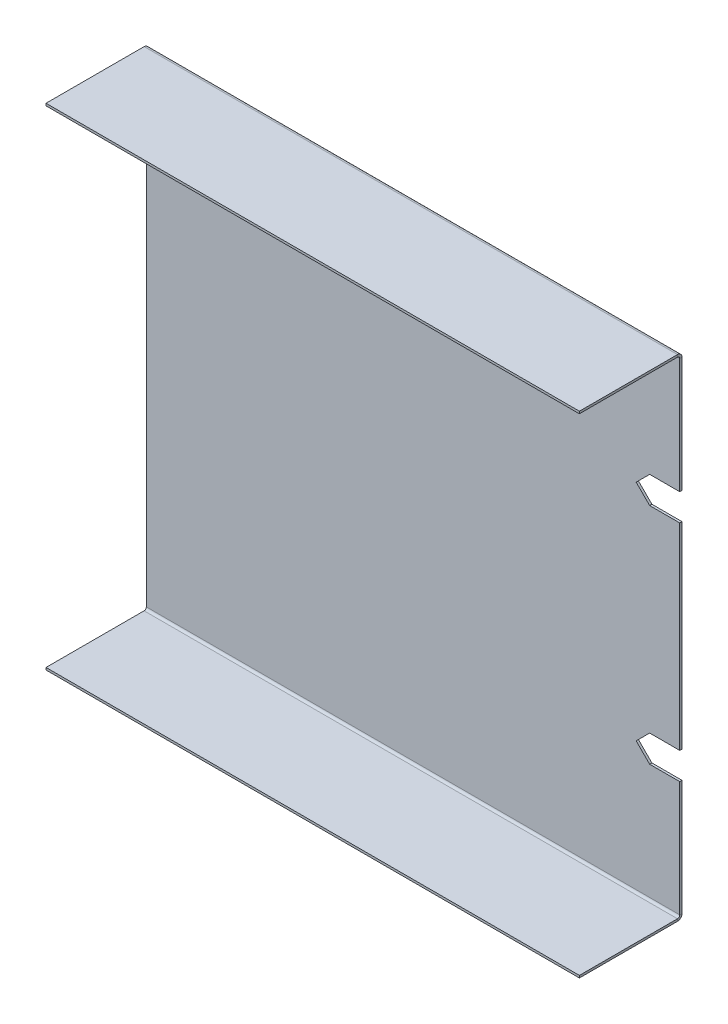
ISO-10303-21;
HEADER;
FILE_DESCRIPTION(('STEP AP214'),'2;1');
FILE_NAME('part.step','',(''),(''),'','','');
FILE_SCHEMA(('AUTOMOTIVE_DESIGN { 1 0 10303 214 1 1 1 1 }'));
ENDSEC;
DATA;
#1=APPLICATION_CONTEXT('core data for automotive mechanical design processes');
#2=APPLICATION_PROTOCOL_DEFINITION('international standard','automotive_design',2000,#1);
#3=PRODUCT_CONTEXT('',#1,'mechanical');
#4=PRODUCT('Part','Part','',(#3));
#5=PRODUCT_RELATED_PRODUCT_CATEGORY('part','',(#4));
#6=PRODUCT_DEFINITION_FORMATION('','',#4);
#7=PRODUCT_DEFINITION_CONTEXT('part definition',#1,'design');
#8=PRODUCT_DEFINITION('design','',#6,#7);
#9=PRODUCT_DEFINITION_SHAPE('','',#8);
#10=(LENGTH_UNIT() NAMED_UNIT(*) SI_UNIT(.MILLI.,.METRE.));
#11=(NAMED_UNIT(*) PLANE_ANGLE_UNIT() SI_UNIT($,.RADIAN.));
#12=(NAMED_UNIT(*) SI_UNIT($,.STERADIAN.) SOLID_ANGLE_UNIT());
#13=UNCERTAINTY_MEASURE_WITH_UNIT(LENGTH_MEASURE(1.E-05),#10,'distance_accuracy_value','');
#14=(GEOMETRIC_REPRESENTATION_CONTEXT(3) GLOBAL_UNCERTAINTY_ASSIGNED_CONTEXT((#13)) GLOBAL_UNIT_ASSIGNED_CONTEXT((#10,
#11,#12)) REPRESENTATION_CONTEXT('',''));
#15=CARTESIAN_POINT('',(0.,0.,0.));
#16=DIRECTION('',(0.,0.,1.));
#17=DIRECTION('',(1.,0.,0.));
#18=AXIS2_PLACEMENT_3D('',#15,#16,#17);
#19=CARTESIAN_POINT('',(0.,0.,-1.5));
#20=DIRECTION('',(0.,0.,1.));
#21=DIRECTION('',(1.,0.,0.));
#22=AXIS2_PLACEMENT_3D('',#19,#20,#21);
#23=PLANE('',#22);
#24=DIRECTION('',(0.,1.,0.));
#25=VECTOR('',#24,1.);
#26=CARTESIAN_POINT('',(192.25,-83.48,-1.5));
#27=LINE('',#26,#25);
#28=CARTESIAN_POINT('',(192.25,-160.232854132356,-1.5));
#29=VERTEX_POINT('',#28);
#30=CARTESIAN_POINT('',(192.25,-83.48,-1.5));
#31=VERTEX_POINT('',#30);
#32=EDGE_CURVE('E50',#29,#31,#27,.T.);
#33=ORIENTED_EDGE('',*,*,#32,.F.);
#34=DIRECTION('',(-1.,0.,0.));
#35=VECTOR('',#34,1.);
#36=CARTESIAN_POINT('',(0.,-160.232854132356,-1.5));
#37=LINE('',#36,#35);
#38=CARTESIAN_POINT('',(-162.5,-160.232854132356,-1.5));
#39=VERTEX_POINT('',#38);
#40=EDGE_CURVE('E368',#29,#39,#37,.T.);
#41=ORIENTED_EDGE('',*,*,#40,.T.);
#42=DIRECTION('',(0.,-1.,0.));
#43=VECTOR('',#42,1.);
#44=CARTESIAN_POINT('',(-162.5,-229.,-1.5));
#45=LINE('',#44,#43);
#46=CARTESIAN_POINT('',(-162.5,160.232854132356,-1.5));
#47=VERTEX_POINT('',#46);
#48=EDGE_CURVE('E255',#47,#39,#45,.T.);
#49=ORIENTED_EDGE('',*,*,#48,.F.);
#50=DIRECTION('',(-1.,0.,0.));
#51=VECTOR('',#50,1.);
#52=CARTESIAN_POINT('',(0.,160.232854132356,-1.5));
#53=LINE('',#52,#51);
#54=CARTESIAN_POINT('',(192.25,160.232854132356,-1.5));
#55=VERTEX_POINT('',#54);
#56=EDGE_CURVE('E248',#55,#47,#53,.T.);
#57=ORIENTED_EDGE('',*,*,#56,.F.);
#58=DIRECTION('',(0.,1.,0.));
#59=VECTOR('',#58,1.);
#60=CARTESIAN_POINT('',(192.25,83.48,-1.5));
#61=LINE('',#60,#59);
#62=CARTESIAN_POINT('',(192.25,83.48,-1.5));
#63=VERTEX_POINT('',#62);
#64=EDGE_CURVE('E291',#63,#55,#61,.T.);
#65=ORIENTED_EDGE('',*,*,#64,.F.);
#66=DIRECTION('',(1.,0.,0.));
#67=VECTOR('',#66,1.);
#68=CARTESIAN_POINT('',(172.25,83.48,-1.5));
#69=LINE('',#68,#67);
#70=CARTESIAN_POINT('',(172.25,83.48,-1.5));
#71=VERTEX_POINT('',#70);
#72=EDGE_CURVE('E296',#71,#63,#69,.T.);
#73=ORIENTED_EDGE('',*,*,#72,.F.);
#74=DIRECTION('',(0.707106781186549,0.707106781186546,0.));
#75=VECTOR('',#74,1.);
#76=CARTESIAN_POINT('',(172.25,83.48,-1.5));
#77=LINE('',#76,#75);
#78=CARTESIAN_POINT('',(163.27,74.5,-1.5));
#79=VERTEX_POINT('',#78);
#80=EDGE_CURVE('E301',#79,#71,#77,.T.);
#81=ORIENTED_EDGE('',*,*,#80,.F.);
#82=DIRECTION('',(-0.707106781186549,0.707106781186546,0.));
#83=VECTOR('',#82,1.);
#84=CARTESIAN_POINT('',(163.27,74.5,-1.5));
#85=LINE('',#84,#83);
#86=CARTESIAN_POINT('',(172.25,65.52,-1.5));
#87=VERTEX_POINT('',#86);
#88=EDGE_CURVE('E306',#87,#79,#85,.T.);
#89=ORIENTED_EDGE('',*,*,#88,.F.);
#90=DIRECTION('',(-1.,0.,0.));
#91=VECTOR('',#90,1.);
#92=CARTESIAN_POINT('',(172.25,65.52,-1.5));
#93=LINE('',#92,#91);
#94=CARTESIAN_POINT('',(192.25,65.52,-1.5));
#95=VERTEX_POINT('',#94);
#96=EDGE_CURVE('E311',#95,#87,#93,.T.);
#97=ORIENTED_EDGE('',*,*,#96,.F.);
#98=DIRECTION('',(0.,1.,0.));
#99=VECTOR('',#98,1.);
#100=CARTESIAN_POINT('',(192.25,65.52,-1.5));
#101=LINE('',#100,#99);
#102=CARTESIAN_POINT('',(192.25,-65.5199999999999,-1.5));
#103=VERTEX_POINT('',#102);
#104=EDGE_CURVE('E316',#103,#95,#101,.T.);
#105=ORIENTED_EDGE('',*,*,#104,.F.);
#106=DIRECTION('',(1.,0.,0.));
#107=VECTOR('',#106,1.);
#108=CARTESIAN_POINT('',(172.25,-65.52,-1.5));
#109=LINE('',#108,#107);
#110=CARTESIAN_POINT('',(172.25,-65.52,-1.5));
#111=VERTEX_POINT('',#110);
#112=EDGE_CURVE('E321',#111,#103,#109,.T.);
#113=ORIENTED_EDGE('',*,*,#112,.F.);
#114=DIRECTION('',(0.707106781186549,0.707106781186546,0.));
#115=VECTOR('',#114,1.);
#116=CARTESIAN_POINT('',(163.27,-74.5,-1.5));
#117=LINE('',#116,#115);
#118=CARTESIAN_POINT('',(163.27,-74.5,-1.5));
#119=VERTEX_POINT('',#118);
#120=EDGE_CURVE('E326',#119,#111,#117,.T.);
#121=ORIENTED_EDGE('',*,*,#120,.F.);
#122=DIRECTION('',(-0.707106781186549,0.707106781186546,0.));
#123=VECTOR('',#122,1.);
#124=CARTESIAN_POINT('',(172.25,-83.48,-1.5));
#125=LINE('',#124,#123);
#126=CARTESIAN_POINT('',(172.25,-83.48,-1.5));
#127=VERTEX_POINT('',#126);
#128=EDGE_CURVE('E331',#127,#119,#125,.T.);
#129=ORIENTED_EDGE('',*,*,#128,.F.);
#130=DIRECTION('',(-1.,0.,0.));
#131=VECTOR('',#130,1.);
#132=CARTESIAN_POINT('',(172.25,-83.48,-1.5));
#133=LINE('',#132,#131);
#134=EDGE_CURVE('E336',#31,#127,#133,.T.);
#135=ORIENTED_EDGE('',*,*,#134,.F.);
#136=EDGE_LOOP('',(#33,#41,#49,#57,#65,#73,#81,#89,#97,#105,#113,#121,#129,#135));
#137=FACE_BOUND('',#136,.T.);
#138=ADVANCED_FACE('F46',(#137),#23,.F.);
#139=CARTESIAN_POINT('',(0.,163.232854132356,-162.267145867644));
#140=DIRECTION('',(0.,-1.,0.));
#141=DIRECTION('',(1.,0.,0.));
#142=AXIS2_PLACEMENT_3D('',#139,#140,#141);
#143=PLANE('',#142);
#144=DIRECTION('',(0.,0.,1.));
#145=VECTOR('',#144,1.);
#146=CARTESIAN_POINT('',(192.25,163.232854132356,-78.7871458676443));
#147=LINE('',#146,#145);
#148=CARTESIAN_POINT('',(192.25,163.232854132356,1.5));
#149=VERTEX_POINT('',#148);
#150=CARTESIAN_POINT('',(192.25,163.232854132356,66.7328541323557));
#151=VERTEX_POINT('',#150);
#152=EDGE_CURVE('E356',#149,#151,#147,.T.);
#153=ORIENTED_EDGE('',*,*,#152,.F.);
#154=DIRECTION('',(-1.,0.,0.));
#155=VECTOR('',#154,1.);
#156=CARTESIAN_POINT('',(0.,163.232854132356,1.5));
#157=LINE('',#156,#155);
#158=CARTESIAN_POINT('',(-162.5,163.232854132356,1.49999999999985));
#159=VERTEX_POINT('',#158);
#160=EDGE_CURVE('E353',#149,#159,#157,.T.);
#161=ORIENTED_EDGE('',*,*,#160,.T.);
#162=DIRECTION('',(0.,0.,-1.));
#163=VECTOR('',#162,1.);
#164=CARTESIAN_POINT('',(-162.5,163.232854132357,-391.267145867644));
#165=LINE('',#164,#163);
#166=CARTESIAN_POINT('',(-162.5,163.232854132356,66.7328541323556));
#167=VERTEX_POINT('',#166);
#168=EDGE_CURVE('E344',#167,#159,#165,.T.);
#169=ORIENTED_EDGE('',*,*,#168,.F.);
#170=DIRECTION('',(-1.,0.,0.));
#171=VECTOR('',#170,1.);
#172=CARTESIAN_POINT('',(162.5,163.232854132356,66.7328541323556));
#173=LINE('',#172,#171);
#174=EDGE_CURVE('E342',#151,#167,#173,.T.);
#175=ORIENTED_EDGE('',*,*,#174,.F.);
#176=EDGE_LOOP('',(#153,#161,#169,#175));
#177=FACE_BOUND('',#176,.T.);
#178=ADVANCED_FACE('F458',(#177),#143,.F.);
#179=CARTESIAN_POINT('',(192.25,163.232854132356,-78.7871458676443));
#180=DIRECTION('',(1.,0.,0.));
#181=DIRECTION('',(0.,1.,0.));
#182=AXIS2_PLACEMENT_3D('',#179,#180,#181);
#183=PLANE('',#182);
#184=DIRECTION('',(0.,-1.,0.));
#185=VECTOR('',#184,1.);
#186=CARTESIAN_POINT('',(192.25,163.232854132355,1.50000000000003));
#187=LINE('',#186,#185);
#188=CARTESIAN_POINT('',(192.25,161.732854132356,1.5));
#189=VERTEX_POINT('',#188);
#190=EDGE_CURVE('E359',#149,#189,#187,.T.);
#191=ORIENTED_EDGE('',*,*,#190,.F.);
#192=ORIENTED_EDGE('',*,*,#152,.T.);
#193=DIRECTION('',(0.,-1.,0.));
#194=VECTOR('',#193,1.);
#195=CARTESIAN_POINT('',(192.25,163.232854132356,66.7328541323557));
#196=LINE('',#195,#194);
#197=CARTESIAN_POINT('',(192.25,161.732854132356,66.7328541323557));
#198=VERTEX_POINT('',#197);
#199=EDGE_CURVE('E350',#151,#198,#196,.T.);
#200=ORIENTED_EDGE('',*,*,#199,.T.);
#201=DIRECTION('',(0.,0.,1.));
#202=VECTOR('',#201,1.);
#203=CARTESIAN_POINT('',(192.25,161.732854132356,-78.7871458676443));
#204=LINE('',#203,#202);
#205=EDGE_CURVE('E345',#189,#198,#204,.T.);
#206=ORIENTED_EDGE('',*,*,#205,.F.);
#207=EDGE_LOOP('',(#191,#192,#200,#206));
#208=FACE_BOUND('',#207,.T.);
#209=ADVANCED_FACE('F450',(#208),#183,.T.);
#210=CARTESIAN_POINT('',(-162.5,163.232854132357,-391.267145867644));
#211=DIRECTION('',(-1.,0.,0.));
#212=DIRECTION('',(0.,-1.,0.));
#213=AXIS2_PLACEMENT_3D('',#210,#211,#212);
#214=PLANE('',#213);
#215=DIRECTION('',(0.,1.,0.));
#216=VECTOR('',#215,1.);
#217=CARTESIAN_POINT('',(-162.5,163.232854132353,1.5));
#218=LINE('',#217,#216);
#219=CARTESIAN_POINT('',(-162.5,161.732854132356,1.49999999999989));
#220=VERTEX_POINT('',#219);
#221=EDGE_CURVE('E365',#220,#159,#218,.T.);
#222=ORIENTED_EDGE('',*,*,#221,.F.);
#223=DIRECTION('',(0.,0.,-1.));
#224=VECTOR('',#223,1.);
#225=CARTESIAN_POINT('',(-162.5,161.732854132357,-391.267145867644));
#226=LINE('',#225,#224);
#227=CARTESIAN_POINT('',(-162.5,161.732854132356,66.7328541323556));
#228=VERTEX_POINT('',#227);
#229=EDGE_CURVE('E349',#228,#220,#226,.T.);
#230=ORIENTED_EDGE('',*,*,#229,.F.);
#231=DIRECTION('',(0.,-1.,0.));
#232=VECTOR('',#231,1.);
#233=CARTESIAN_POINT('',(-162.5,163.232854132356,66.7328541323556));
#234=LINE('',#233,#232);
#235=EDGE_CURVE('E354',#167,#228,#234,.T.);
#236=ORIENTED_EDGE('',*,*,#235,.F.);
#237=ORIENTED_EDGE('',*,*,#168,.T.);
#238=EDGE_LOOP('',(#222,#230,#236,#237));
#239=FACE_BOUND('',#238,.T.);
#240=ADVANCED_FACE('F460',(#239),#214,.T.);
#241=CARTESIAN_POINT('',(-162.5,163.232854132356,66.7328541323556));
#242=DIRECTION('',(0.,0.,1.));
#243=DIRECTION('',(0.,-1.,0.));
#244=AXIS2_PLACEMENT_3D('',#241,#242,#243);
#245=PLANE('',#244);
#246=DIRECTION('',(-1.,0.,0.));
#247=VECTOR('',#246,1.);
#248=CARTESIAN_POINT('',(-162.5,161.732854132356,66.7328541323556));
#249=LINE('',#248,#247);
#250=EDGE_CURVE('E346',#198,#228,#249,.T.);
#251=ORIENTED_EDGE('',*,*,#250,.F.);
#252=ORIENTED_EDGE('',*,*,#199,.F.);
#253=ORIENTED_EDGE('',*,*,#174,.T.);
#254=ORIENTED_EDGE('',*,*,#235,.T.);
#255=EDGE_LOOP('',(#251,#252,#253,#254));
#256=FACE_BOUND('',#255,.T.);
#257=ADVANCED_FACE('F454',(#256),#245,.T.);
#258=CARTESIAN_POINT('',(0.,161.732854132356,-162.267145867644));
#259=DIRECTION('',(0.,-1.,0.));
#260=DIRECTION('',(1.,0.,0.));
#261=AXIS2_PLACEMENT_3D('',#258,#259,#260);
#262=PLANE('',#261);
#263=DIRECTION('',(-1.,0.,0.));
#264=VECTOR('',#263,1.);
#265=CARTESIAN_POINT('',(0.,161.732854132356,1.5));
#266=LINE('',#265,#264);
#267=EDGE_CURVE('E362',#189,#220,#266,.T.);
#268=ORIENTED_EDGE('',*,*,#267,.F.);
#269=ORIENTED_EDGE('',*,*,#205,.T.);
#270=ORIENTED_EDGE('',*,*,#250,.T.);
#271=ORIENTED_EDGE('',*,*,#229,.T.);
#272=EDGE_LOOP('',(#268,#269,#270,#271));
#273=FACE_BOUND('',#272,.T.);
#274=ADVANCED_FACE('F444',(#273),#262,.T.);
#275=CARTESIAN_POINT('',(192.25,-83.48,-1.5));
#276=DIRECTION('',(1.,0.,0.));
#277=DIRECTION('',(0.,0.,-1.));
#278=AXIS2_PLACEMENT_3D('',#275,#276,#277);
#279=PLANE('',#278);
#280=DIRECTION('',(0.,0.,1.));
#281=VECTOR('',#280,1.);
#282=CARTESIAN_POINT('',(192.25,-160.232854132356,-1.50000000000054));
#283=LINE('',#282,#281);
#284=CARTESIAN_POINT('',(192.25,-160.232854132356,0.));
#285=VERTEX_POINT('',#284);
#286=EDGE_CURVE('E375',#29,#285,#283,.T.);
#287=ORIENTED_EDGE('',*,*,#286,.F.);
#288=ORIENTED_EDGE('',*,*,#32,.T.);
#289=DIRECTION('',(0.,0.,1.));
#290=VECTOR('',#289,1.);
#291=CARTESIAN_POINT('',(192.25,-83.48,-1.5));
#292=LINE('',#291,#290);
#293=CARTESIAN_POINT('',(192.25,-83.48,0.));
#294=VERTEX_POINT('',#293);
#295=EDGE_CURVE('E339',#31,#294,#292,.T.);
#296=ORIENTED_EDGE('',*,*,#295,.T.);
#297=DIRECTION('',(0.,1.,0.));
#298=VECTOR('',#297,1.);
#299=CARTESIAN_POINT('',(192.25,-83.48,0.));
#300=LINE('',#299,#298);
#301=EDGE_CURVE('E71',#285,#294,#300,.T.);
#302=ORIENTED_EDGE('',*,*,#301,.F.);
#303=EDGE_LOOP('',(#287,#288,#296,#302));
#304=FACE_BOUND('',#303,.T.);
#305=ADVANCED_FACE('F384',(#304),#279,.T.);
#306=CARTESIAN_POINT('',(172.25,-83.48,-1.5));
#307=DIRECTION('',(0.,1.,0.));
#308=DIRECTION('',(0.,0.,1.));
#309=AXIS2_PLACEMENT_3D('',#306,#307,#308);
#310=PLANE('',#309);
#311=DIRECTION('',(-1.,0.,0.));
#312=VECTOR('',#311,1.);
#313=CARTESIAN_POINT('',(172.25,-83.48,0.));
#314=LINE('',#313,#312);
#315=CARTESIAN_POINT('',(172.25,-83.48,0.));
#316=VERTEX_POINT('',#315);
#317=EDGE_CURVE('E280',#294,#316,#314,.T.);
#318=ORIENTED_EDGE('',*,*,#317,.F.);
#319=ORIENTED_EDGE('',*,*,#295,.F.);
#320=ORIENTED_EDGE('',*,*,#134,.T.);
#321=DIRECTION('',(0.,0.,1.));
#322=VECTOR('',#321,1.);
#323=CARTESIAN_POINT('',(172.25,-83.48,-1.5));
#324=LINE('',#323,#322);
#325=EDGE_CURVE('E334',#127,#316,#324,.T.);
#326=ORIENTED_EDGE('',*,*,#325,.T.);
#327=EDGE_LOOP('',(#318,#319,#320,#326));
#328=FACE_BOUND('',#327,.T.);
#329=ADVANCED_FACE('F387',(#328),#310,.T.);
#330=CARTESIAN_POINT('',(172.25,-83.48,-1.5));
#331=DIRECTION('',(0.707106781186546,0.707106781186549,0.));
#332=DIRECTION('',(-0.707106781186549,0.707106781186546,0.));
#333=AXIS2_PLACEMENT_3D('',#330,#331,#332);
#334=PLANE('',#333);
#335=DIRECTION('',(-0.707106781186549,0.707106781186546,0.));
#336=VECTOR('',#335,1.);
#337=CARTESIAN_POINT('',(172.25,-83.48,0.));
#338=LINE('',#337,#336);
#339=CARTESIAN_POINT('',(163.27,-74.5,0.));
#340=VERTEX_POINT('',#339);
#341=EDGE_CURVE('E277',#316,#340,#338,.T.);
#342=ORIENTED_EDGE('',*,*,#341,.F.);
#343=ORIENTED_EDGE('',*,*,#325,.F.);
#344=ORIENTED_EDGE('',*,*,#128,.T.);
#345=DIRECTION('',(0.,0.,1.));
#346=VECTOR('',#345,1.);
#347=CARTESIAN_POINT('',(163.27,-74.5,-1.5));
#348=LINE('',#347,#346);
#349=EDGE_CURVE('E329',#119,#340,#348,.T.);
#350=ORIENTED_EDGE('',*,*,#349,.T.);
#351=EDGE_LOOP('',(#342,#343,#344,#350));
#352=FACE_BOUND('',#351,.T.);
#353=ADVANCED_FACE('F391',(#352),#334,.T.);
#354=CARTESIAN_POINT('',(163.27,-74.5,-1.5));
#355=DIRECTION('',(0.707106781186546,-0.707106781186549,0.));
#356=DIRECTION('',(0.707106781186549,0.707106781186546,0.));
#357=AXIS2_PLACEMENT_3D('',#354,#355,#356);
#358=PLANE('',#357);
#359=DIRECTION('',(0.707106781186549,0.707106781186546,0.));
#360=VECTOR('',#359,1.);
#361=CARTESIAN_POINT('',(163.27,-74.5,0.));
#362=LINE('',#361,#360);
#363=CARTESIAN_POINT('',(172.25,-65.52,0.));
#364=VERTEX_POINT('',#363);
#365=EDGE_CURVE('E274',#340,#364,#362,.T.);
#366=ORIENTED_EDGE('',*,*,#365,.F.);
#367=ORIENTED_EDGE('',*,*,#349,.F.);
#368=ORIENTED_EDGE('',*,*,#120,.T.);
#369=DIRECTION('',(0.,0.,1.));
#370=VECTOR('',#369,1.);
#371=CARTESIAN_POINT('',(172.25,-65.52,-1.5));
#372=LINE('',#371,#370);
#373=EDGE_CURVE('E324',#111,#364,#372,.T.);
#374=ORIENTED_EDGE('',*,*,#373,.T.);
#375=EDGE_LOOP('',(#366,#367,#368,#374));
#376=FACE_BOUND('',#375,.T.);
#377=ADVANCED_FACE('F395',(#376),#358,.T.);
#378=CARTESIAN_POINT('',(172.25,-65.52,-1.5));
#379=DIRECTION('',(0.,-1.,0.));
#380=DIRECTION('',(1.,0.,0.));
#381=AXIS2_PLACEMENT_3D('',#378,#379,#380);
#382=PLANE('',#381);
#383=DIRECTION('',(1.,0.,0.));
#384=VECTOR('',#383,1.);
#385=CARTESIAN_POINT('',(172.25,-65.52,0.));
#386=LINE('',#385,#384);
#387=CARTESIAN_POINT('',(192.25,-65.5199999999999,0.));
#388=VERTEX_POINT('',#387);
#389=EDGE_CURVE('E271',#364,#388,#386,.T.);
#390=ORIENTED_EDGE('',*,*,#389,.F.);
#391=ORIENTED_EDGE('',*,*,#373,.F.);
#392=ORIENTED_EDGE('',*,*,#112,.T.);
#393=DIRECTION('',(0.,0.,1.));
#394=VECTOR('',#393,1.);
#395=CARTESIAN_POINT('',(192.25,-65.5199999999999,-1.5));
#396=LINE('',#395,#394);
#397=EDGE_CURVE('E319',#103,#388,#396,.T.);
#398=ORIENTED_EDGE('',*,*,#397,.T.);
#399=EDGE_LOOP('',(#390,#391,#392,#398));
#400=FACE_BOUND('',#399,.T.);
#401=ADVANCED_FACE('F399',(#400),#382,.T.);
#402=CARTESIAN_POINT('',(192.25,65.52,-1.5));
#403=DIRECTION('',(1.,0.,0.));
#404=DIRECTION('',(0.,1.,0.));
#405=AXIS2_PLACEMENT_3D('',#402,#403,#404);
#406=PLANE('',#405);
#407=DIRECTION('',(0.,1.,0.));
#408=VECTOR('',#407,1.);
#409=CARTESIAN_POINT('',(192.25,65.52,0.));
#410=LINE('',#409,#408);
#411=CARTESIAN_POINT('',(192.25,65.52,0.));
#412=VERTEX_POINT('',#411);
#413=EDGE_CURVE('E268',#388,#412,#410,.T.);
#414=ORIENTED_EDGE('',*,*,#413,.F.);
#415=ORIENTED_EDGE('',*,*,#397,.F.);
#416=ORIENTED_EDGE('',*,*,#104,.T.);
#417=DIRECTION('',(0.,0.,1.));
#418=VECTOR('',#417,1.);
#419=CARTESIAN_POINT('',(192.25,65.52,-1.5));
#420=LINE('',#419,#418);
#421=EDGE_CURVE('E314',#95,#412,#420,.T.);
#422=ORIENTED_EDGE('',*,*,#421,.T.);
#423=EDGE_LOOP('',(#414,#415,#416,#422));
#424=FACE_BOUND('',#423,.T.);
#425=ADVANCED_FACE('F403',(#424),#406,.T.);
#426=CARTESIAN_POINT('',(172.25,65.52,-1.5));
#427=DIRECTION('',(0.,1.,0.));
#428=DIRECTION('',(0.,0.,1.));
#429=AXIS2_PLACEMENT_3D('',#426,#427,#428);
#430=PLANE('',#429);
#431=DIRECTION('',(-1.,0.,0.));
#432=VECTOR('',#431,1.);
#433=CARTESIAN_POINT('',(172.25,65.52,0.));
#434=LINE('',#433,#432);
#435=CARTESIAN_POINT('',(172.25,65.52,0.));
#436=VERTEX_POINT('',#435);
#437=EDGE_CURVE('E265',#412,#436,#434,.T.);
#438=ORIENTED_EDGE('',*,*,#437,.F.);
#439=ORIENTED_EDGE('',*,*,#421,.F.);
#440=ORIENTED_EDGE('',*,*,#96,.T.);
#441=DIRECTION('',(0.,0.,1.));
#442=VECTOR('',#441,1.);
#443=CARTESIAN_POINT('',(172.25,65.52,-1.5));
#444=LINE('',#443,#442);
#445=EDGE_CURVE('E309',#87,#436,#444,.T.);
#446=ORIENTED_EDGE('',*,*,#445,.T.);
#447=EDGE_LOOP('',(#438,#439,#440,#446));
#448=FACE_BOUND('',#447,.T.);
#449=ADVANCED_FACE('F407',(#448),#430,.T.);
#450=CARTESIAN_POINT('',(163.27,74.5,-1.5));
#451=DIRECTION('',(0.707106781186546,0.707106781186549,0.));
#452=DIRECTION('',(-0.707106781186549,0.707106781186546,0.));
#453=AXIS2_PLACEMENT_3D('',#450,#451,#452);
#454=PLANE('',#453);
#455=DIRECTION('',(-0.707106781186549,0.707106781186546,0.));
#456=VECTOR('',#455,1.);
#457=CARTESIAN_POINT('',(163.27,74.5,0.));
#458=LINE('',#457,#456);
#459=CARTESIAN_POINT('',(163.27,74.5,0.));
#460=VERTEX_POINT('',#459);
#461=EDGE_CURVE('E262',#436,#460,#458,.T.);
#462=ORIENTED_EDGE('',*,*,#461,.F.);
#463=ORIENTED_EDGE('',*,*,#445,.F.);
#464=ORIENTED_EDGE('',*,*,#88,.T.);
#465=DIRECTION('',(0.,0.,1.));
#466=VECTOR('',#465,1.);
#467=CARTESIAN_POINT('',(163.27,74.5,-1.5));
#468=LINE('',#467,#466);
#469=EDGE_CURVE('E304',#79,#460,#468,.T.);
#470=ORIENTED_EDGE('',*,*,#469,.T.);
#471=EDGE_LOOP('',(#462,#463,#464,#470));
#472=FACE_BOUND('',#471,.T.);
#473=ADVANCED_FACE('F411',(#472),#454,.T.);
#474=CARTESIAN_POINT('',(172.25,83.48,-1.5));
#475=DIRECTION('',(0.707106781186546,-0.707106781186549,0.));
#476=DIRECTION('',(0.707106781186549,0.707106781186546,0.));
#477=AXIS2_PLACEMENT_3D('',#474,#475,#476);
#478=PLANE('',#477);
#479=DIRECTION('',(0.707106781186549,0.707106781186546,0.));
#480=VECTOR('',#479,1.);
#481=CARTESIAN_POINT('',(172.25,83.48,0.));
#482=LINE('',#481,#480);
#483=CARTESIAN_POINT('',(172.25,83.48,0.));
#484=VERTEX_POINT('',#483);
#485=EDGE_CURVE('E259',#460,#484,#482,.T.);
#486=ORIENTED_EDGE('',*,*,#485,.F.);
#487=ORIENTED_EDGE('',*,*,#469,.F.);
#488=ORIENTED_EDGE('',*,*,#80,.T.);
#489=DIRECTION('',(0.,0.,1.));
#490=VECTOR('',#489,1.);
#491=CARTESIAN_POINT('',(172.25,83.48,-1.5));
#492=LINE('',#491,#490);
#493=EDGE_CURVE('E299',#71,#484,#492,.T.);
#494=ORIENTED_EDGE('',*,*,#493,.T.);
#495=EDGE_LOOP('',(#486,#487,#488,#494));
#496=FACE_BOUND('',#495,.T.);
#497=ADVANCED_FACE('F415',(#496),#478,.T.);
#498=CARTESIAN_POINT('',(172.25,83.48,-1.5));
#499=DIRECTION('',(0.,-1.,0.));
#500=DIRECTION('',(0.,0.,-1.));
#501=AXIS2_PLACEMENT_3D('',#498,#499,#500);
#502=PLANE('',#501);
#503=DIRECTION('',(1.,0.,0.));
#504=VECTOR('',#503,1.);
#505=CARTESIAN_POINT('',(172.25,83.48,0.));
#506=LINE('',#505,#504);
#507=CARTESIAN_POINT('',(192.25,83.48,0.));
#508=VERTEX_POINT('',#507);
#509=EDGE_CURVE('E256',#484,#508,#506,.T.);
#510=ORIENTED_EDGE('',*,*,#509,.F.);
#511=ORIENTED_EDGE('',*,*,#493,.F.);
#512=ORIENTED_EDGE('',*,*,#72,.T.);
#513=DIRECTION('',(0.,0.,1.));
#514=VECTOR('',#513,1.);
#515=CARTESIAN_POINT('',(192.25,83.48,-1.5));
#516=LINE('',#515,#514);
#517=EDGE_CURVE('E294',#63,#508,#516,.T.);
#518=ORIENTED_EDGE('',*,*,#517,.T.);
#519=EDGE_LOOP('',(#510,#511,#512,#518));
#520=FACE_BOUND('',#519,.T.);
#521=ADVANCED_FACE('F483',(#520),#502,.T.);
#522=CARTESIAN_POINT('',(192.25,83.48,-1.5));
#523=DIRECTION('',(1.,0.,0.));
#524=DIRECTION('',(0.,0.,-1.));
#525=AXIS2_PLACEMENT_3D('',#522,#523,#524);
#526=PLANE('',#525);
#527=ORIENTED_EDGE('',*,*,#64,.T.);
#528=DIRECTION('',(0.,0.,1.));
#529=VECTOR('',#528,1.);
#530=CARTESIAN_POINT('',(192.25,160.232854132356,-1.49999999999946));
#531=LINE('',#530,#529);
#532=CARTESIAN_POINT('',(192.25,160.232854132356,0.));
#533=VERTEX_POINT('',#532);
#534=EDGE_CURVE('E288',#55,#533,#531,.T.);
#535=ORIENTED_EDGE('',*,*,#534,.T.);
#536=DIRECTION('',(0.,1.,0.));
#537=VECTOR('',#536,1.);
#538=CARTESIAN_POINT('',(192.25,83.48,0.));
#539=LINE('',#538,#537);
#540=EDGE_CURVE('E285',#508,#533,#539,.T.);
#541=ORIENTED_EDGE('',*,*,#540,.F.);
#542=ORIENTED_EDGE('',*,*,#517,.F.);
#543=EDGE_LOOP('',(#527,#535,#541,#542));
#544=FACE_BOUND('',#543,.T.);
#545=ADVANCED_FACE('F420',(#544),#526,.T.);
#546=CARTESIAN_POINT('',(0.,0.,0.));
#547=DIRECTION('',(0.,0.,1.));
#548=DIRECTION('',(1.,0.,0.));
#549=AXIS2_PLACEMENT_3D('',#546,#547,#548);
#550=PLANE('',#549);
#551=DIRECTION('',(-1.,0.,0.));
#552=VECTOR('',#551,1.);
#553=CARTESIAN_POINT('',(0.,-160.232854132356,0.));
#554=LINE('',#553,#552);
#555=CARTESIAN_POINT('',(-162.5,-160.232854132356,0.));
#556=VERTEX_POINT('',#555);
#557=EDGE_CURVE('E55',#285,#556,#554,.T.);
#558=ORIENTED_EDGE('',*,*,#557,.F.);
#559=ORIENTED_EDGE('',*,*,#301,.T.);
#560=ORIENTED_EDGE('',*,*,#317,.T.);
#561=ORIENTED_EDGE('',*,*,#341,.T.);
#562=ORIENTED_EDGE('',*,*,#365,.T.);
#563=ORIENTED_EDGE('',*,*,#389,.T.);
#564=ORIENTED_EDGE('',*,*,#413,.T.);
#565=ORIENTED_EDGE('',*,*,#437,.T.);
#566=ORIENTED_EDGE('',*,*,#461,.T.);
#567=ORIENTED_EDGE('',*,*,#485,.T.);
#568=ORIENTED_EDGE('',*,*,#509,.T.);
#569=ORIENTED_EDGE('',*,*,#540,.T.);
#570=DIRECTION('',(-1.,0.,0.));
#571=VECTOR('',#570,1.);
#572=CARTESIAN_POINT('',(0.,160.232854132356,0.));
#573=LINE('',#572,#571);
#574=CARTESIAN_POINT('',(-162.5,160.232854132356,0.));
#575=VERTEX_POINT('',#574);
#576=EDGE_CURVE('E283',#533,#575,#573,.T.);
#577=ORIENTED_EDGE('',*,*,#576,.T.);
#578=DIRECTION('',(0.,-1.,0.));
#579=VECTOR('',#578,1.);
#580=CARTESIAN_POINT('',(-162.5,-229.,0.));
#581=LINE('',#580,#579);
#582=EDGE_CURVE('E63',#575,#556,#581,.T.);
#583=ORIENTED_EDGE('',*,*,#582,.T.);
#584=EDGE_LOOP('',(#558,#559,#560,#561,#562,#563,#564,#565,#566,#567,#568,#569,#577,#583));
#585=FACE_BOUND('',#584,.T.);
#586=ADVANCED_FACE('F381',(#585),#550,.T.);
#587=CARTESIAN_POINT('',(-162.5,-229.,-1.5));
#588=DIRECTION('',(-1.,0.,0.));
#589=DIRECTION('',(0.,0.,1.));
#590=AXIS2_PLACEMENT_3D('',#587,#588,#589);
#591=PLANE('',#590);
#592=DIRECTION('',(0.,0.,-1.));
#593=VECTOR('',#592,1.);
#594=CARTESIAN_POINT('',(-162.5,-160.232854132356,-1.49999999999952));
#595=LINE('',#594,#593);
#596=EDGE_CURVE('E12',#556,#39,#595,.T.);
#597=ORIENTED_EDGE('',*,*,#596,.F.);
#598=ORIENTED_EDGE('',*,*,#582,.F.);
#599=DIRECTION('',(0.,0.,-1.));
#600=VECTOR('',#599,1.);
#601=CARTESIAN_POINT('',(-162.5,160.232854132356,-1.49999999999728));
#602=LINE('',#601,#600);
#603=EDGE_CURVE('E252',#575,#47,#602,.T.);
#604=ORIENTED_EDGE('',*,*,#603,.T.);
#605=ORIENTED_EDGE('',*,*,#48,.T.);
#606=EDGE_LOOP('',(#597,#598,#604,#605));
#607=FACE_BOUND('',#606,.T.);
#608=ADVANCED_FACE('F48',(#607),#591,.T.);
#609=CARTESIAN_POINT('',(192.25,160.232854132356,1.5));
#610=DIRECTION('',(1.,0.,0.));
#611=DIRECTION('',(0.,0.,-1.));
#612=AXIS2_PLACEMENT_3D('',#609,#610,#611);
#613=PLANE('',#612);
#614=ORIENTED_EDGE('',*,*,#190,.T.);
#615=CARTESIAN_POINT('',(192.25,160.232854132356,1.5));
#616=DIRECTION('',(1.,0.,0.));
#617=DIRECTION('',(0.,0.,-1.));
#618=AXIS2_PLACEMENT_3D('',#615,#616,#617);
#619=CIRCLE('',#618,1.5);
#620=EDGE_CURVE('E236',#189,#533,#619,.F.);
#621=ORIENTED_EDGE('',*,*,#620,.T.);
#622=ORIENTED_EDGE('',*,*,#534,.F.);
#623=CARTESIAN_POINT('',(192.25,160.232854132356,1.5));
#624=DIRECTION('',(-1.,0.,0.));
#625=DIRECTION('',(0.,0.,-1.));
#626=AXIS2_PLACEMENT_3D('',#623,#624,#625);
#627=CIRCLE('',#626,3.);
#628=EDGE_CURVE('E241',#149,#55,#627,.T.);
#629=ORIENTED_EDGE('',*,*,#628,.F.);
#630=EDGE_LOOP('',(#614,#621,#622,#629));
#631=FACE_BOUND('',#630,.T.);
#632=ADVANCED_FACE('F424',(#631),#613,.T.);
#633=CARTESIAN_POINT('',(-162.5,160.232854132356,1.5));
#634=DIRECTION('',(-1.,0.,0.));
#635=DIRECTION('',(0.,0.,1.));
#636=AXIS2_PLACEMENT_3D('',#633,#634,#635);
#637=PLANE('',#636);
#638=ORIENTED_EDGE('',*,*,#603,.F.);
#639=CARTESIAN_POINT('',(-162.5,160.232854132356,1.5));
#640=DIRECTION('',(1.,0.,0.));
#641=DIRECTION('',(0.,0.,-1.));
#642=AXIS2_PLACEMENT_3D('',#639,#640,#641);
#643=CIRCLE('',#642,1.5);
#644=EDGE_CURVE('E245',#575,#220,#643,.T.);
#645=ORIENTED_EDGE('',*,*,#644,.T.);
#646=ORIENTED_EDGE('',*,*,#221,.T.);
#647=CARTESIAN_POINT('',(-162.5,160.232854132356,1.5));
#648=DIRECTION('',(1.,0.,0.));
#649=DIRECTION('',(0.,0.,1.));
#650=AXIS2_PLACEMENT_3D('',#647,#648,#649);
#651=CIRCLE('',#650,3.);
#652=EDGE_CURVE('E244',#47,#159,#651,.T.);
#653=ORIENTED_EDGE('',*,*,#652,.F.);
#654=EDGE_LOOP('',(#638,#645,#646,#653));
#655=FACE_BOUND('',#654,.T.);
#656=ADVANCED_FACE('F439',(#655),#637,.T.);
#657=CARTESIAN_POINT('',(-339.895776302206,160.232854132356,1.5));
#658=DIRECTION('',(1.,0.,0.));
#659=DIRECTION('',(0.,0.,-1.));
#660=AXIS2_PLACEMENT_3D('',#657,#658,#659);
#661=CYLINDRICAL_SURFACE('',#660,3.);
#662=ORIENTED_EDGE('',*,*,#652,.T.);
#663=ORIENTED_EDGE('',*,*,#160,.F.);
#664=ORIENTED_EDGE('',*,*,#628,.T.);
#665=ORIENTED_EDGE('',*,*,#56,.T.);
#666=EDGE_LOOP('',(#662,#663,#664,#665));
#667=FACE_BOUND('',#666,.T.);
#668=ADVANCED_FACE('F430',(#667),#661,.T.);
#669=CARTESIAN_POINT('',(-339.895776302206,160.232854132356,1.5));
#670=DIRECTION('',(1.,0.,0.));
#671=DIRECTION('',(0.,0.,-1.));
#672=AXIS2_PLACEMENT_3D('',#669,#670,#671);
#673=CYLINDRICAL_SURFACE('',#672,1.5);
#674=ORIENTED_EDGE('',*,*,#644,.F.);
#675=ORIENTED_EDGE('',*,*,#576,.F.);
#676=ORIENTED_EDGE('',*,*,#620,.F.);
#677=ORIENTED_EDGE('',*,*,#267,.T.);
#678=EDGE_LOOP('',(#674,#675,#676,#677));
#679=FACE_BOUND('',#678,.T.);
#680=ADVANCED_FACE('F441',(#679),#673,.F.);
#681=CARTESIAN_POINT('',(192.25,-160.232854132356,1.5));
#682=DIRECTION('',(1.,0.,0.));
#683=DIRECTION('',(0.,0.,-1.));
#684=AXIS2_PLACEMENT_3D('',#681,#682,#683);
#685=PLANE('',#684);
#686=ORIENTED_EDGE('',*,*,#286,.T.);
#687=CARTESIAN_POINT('',(192.25,-160.232854132356,1.5));
#688=DIRECTION('',(-1.,0.,0.));
#689=DIRECTION('',(0.,0.,1.));
#690=AXIS2_PLACEMENT_3D('',#687,#688,#689);
#691=CIRCLE('',#690,1.5);
#692=CARTESIAN_POINT('',(192.25,-161.732854132356,1.49999999999995));
#693=VERTEX_POINT('',#692);
#694=EDGE_CURVE('E216',#285,#693,#691,.T.);
#695=ORIENTED_EDGE('',*,*,#694,.T.);
#696=DIRECTION('',(0.,1.,0.));
#697=VECTOR('',#696,1.);
#698=CARTESIAN_POINT('',(192.25,-163.232854132356,1.49999999999995));
#699=LINE('',#698,#697);
#700=CARTESIAN_POINT('',(192.25,-163.232854132356,1.49999999999997));
#701=VERTEX_POINT('',#700);
#702=EDGE_CURVE('E804',#701,#693,#699,.T.);
#703=ORIENTED_EDGE('',*,*,#702,.F.);
#704=CARTESIAN_POINT('',(192.25,-160.232854132356,1.5));
#705=DIRECTION('',(-1.,0.,0.));
#706=DIRECTION('',(0.,0.,-1.));
#707=AXIS2_PLACEMENT_3D('',#704,#705,#706);
#708=CIRCLE('',#707,3.);
#709=EDGE_CURVE('E229',#29,#701,#708,.T.);
#710=ORIENTED_EDGE('',*,*,#709,.F.);
#711=EDGE_LOOP('',(#686,#695,#703,#710));
#712=FACE_BOUND('',#711,.T.);
#713=ADVANCED_FACE('F592',(#712),#685,.T.);
#714=CARTESIAN_POINT('',(-162.5,-160.232854132356,1.5));
#715=DIRECTION('',(-1.,0.,0.));
#716=DIRECTION('',(0.,0.,1.));
#717=AXIS2_PLACEMENT_3D('',#714,#715,#716);
#718=PLANE('',#717);
#719=DIRECTION('',(0.,-1.,0.));
#720=VECTOR('',#719,1.);
#721=CARTESIAN_POINT('',(-162.5,-163.232854132355,1.49999999999995));
#722=LINE('',#721,#720);
#723=CARTESIAN_POINT('',(-162.5,-161.732854132356,1.5));
#724=VERTEX_POINT('',#723);
#725=CARTESIAN_POINT('',(-162.5,-163.232854132356,1.50000000000004));
#726=VERTEX_POINT('',#725);
#727=EDGE_CURVE('E204',#724,#726,#722,.T.);
#728=ORIENTED_EDGE('',*,*,#727,.F.);
#729=CARTESIAN_POINT('',(-162.5,-160.232854132356,1.5));
#730=DIRECTION('',(-1.,0.,0.));
#731=DIRECTION('',(0.,0.,1.));
#732=AXIS2_PLACEMENT_3D('',#729,#730,#731);
#733=CIRCLE('',#732,1.5);
#734=EDGE_CURVE('E233',#724,#556,#733,.F.);
#735=ORIENTED_EDGE('',*,*,#734,.T.);
#736=ORIENTED_EDGE('',*,*,#596,.T.);
#737=CARTESIAN_POINT('',(-162.5,-160.232854132356,1.5));
#738=DIRECTION('',(1.,0.,0.));
#739=DIRECTION('',(0.,0.,1.));
#740=AXIS2_PLACEMENT_3D('',#737,#738,#739);
#741=CIRCLE('',#740,3.);
#742=EDGE_CURVE('E232',#726,#39,#741,.T.);
#743=ORIENTED_EDGE('',*,*,#742,.F.);
#744=EDGE_LOOP('',(#728,#735,#736,#743));
#745=FACE_BOUND('',#744,.T.);
#746=ADVANCED_FACE('F611',(#745),#718,.T.);
#747=CARTESIAN_POINT('',(369.645776302206,-160.232854132356,1.5));
#748=DIRECTION('',(-1.,0.,0.));
#749=DIRECTION('',(0.,0.,1.));
#750=AXIS2_PLACEMENT_3D('',#747,#748,#749);
#751=CYLINDRICAL_SURFACE('',#750,3.);
#752=ORIENTED_EDGE('',*,*,#742,.T.);
#753=ORIENTED_EDGE('',*,*,#40,.F.);
#754=ORIENTED_EDGE('',*,*,#709,.T.);
#755=DIRECTION('',(-1.,0.,0.));
#756=VECTOR('',#755,1.);
#757=CARTESIAN_POINT('',(0.,-163.232854132356,1.49999999999997));
#758=LINE('',#757,#756);
#759=EDGE_CURVE('E223',#701,#726,#758,.T.);
#760=ORIENTED_EDGE('',*,*,#759,.T.);
#761=EDGE_LOOP('',(#752,#753,#754,#760));
#762=FACE_BOUND('',#761,.T.);
#763=ADVANCED_FACE('F622',(#762),#751,.T.);
#764=CARTESIAN_POINT('',(369.645776302206,-160.232854132356,1.5));
#765=DIRECTION('',(-1.,0.,0.));
#766=DIRECTION('',(0.,0.,1.));
#767=AXIS2_PLACEMENT_3D('',#764,#765,#766);
#768=CYLINDRICAL_SURFACE('',#767,1.5);
#769=ORIENTED_EDGE('',*,*,#734,.F.);
#770=DIRECTION('',(-1.,0.,0.));
#771=VECTOR('',#770,1.);
#772=CARTESIAN_POINT('',(0.,-161.732854132356,1.49999999999997));
#773=LINE('',#772,#771);
#774=EDGE_CURVE('E803',#693,#724,#773,.T.);
#775=ORIENTED_EDGE('',*,*,#774,.F.);
#776=ORIENTED_EDGE('',*,*,#694,.F.);
#777=ORIENTED_EDGE('',*,*,#557,.T.);
#778=EDGE_LOOP('',(#769,#775,#776,#777));
#779=FACE_BOUND('',#778,.T.);
#780=ADVANCED_FACE('F632',(#779),#768,.F.);
#781=CARTESIAN_POINT('',(162.5,-163.232854132356,66.7328541323557));
#782=DIRECTION('',(0.,0.,1.));
#783=DIRECTION('',(0.,-1.,0.));
#784=AXIS2_PLACEMENT_3D('',#781,#782,#783);
#785=PLANE('',#784);
#786=DIRECTION('',(1.,0.,0.));
#787=VECTOR('',#786,1.);
#788=CARTESIAN_POINT('',(162.5,-161.732854132356,66.7328541323557));
#789=LINE('',#788,#787);
#790=CARTESIAN_POINT('',(-162.5,-161.732854132356,66.7328541323557));
#791=VERTEX_POINT('',#790);
#792=CARTESIAN_POINT('',(192.25,-161.732854132356,66.7328541323557));
#793=VERTEX_POINT('',#792);
#794=EDGE_CURVE('E215',#791,#793,#789,.T.);
#795=ORIENTED_EDGE('',*,*,#794,.F.);
#796=DIRECTION('',(0.,1.,0.));
#797=VECTOR('',#796,1.);
#798=CARTESIAN_POINT('',(-162.5,-163.232854132356,66.7328541323557));
#799=LINE('',#798,#797);
#800=CARTESIAN_POINT('',(-162.5,-163.232854132356,66.7328541323557));
#801=VERTEX_POINT('',#800);
#802=EDGE_CURVE('E202',#801,#791,#799,.T.);
#803=ORIENTED_EDGE('',*,*,#802,.F.);
#804=DIRECTION('',(1.,0.,0.));
#805=VECTOR('',#804,1.);
#806=CARTESIAN_POINT('',(-162.5,-163.232854132356,66.7328541323557));
#807=LINE('',#806,#805);
#808=CARTESIAN_POINT('',(192.25,-163.232854132356,66.7328541323557));
#809=VERTEX_POINT('',#808);
#810=EDGE_CURVE('E212',#801,#809,#807,.T.);
#811=ORIENTED_EDGE('',*,*,#810,.T.);
#812=DIRECTION('',(0.,1.,0.));
#813=VECTOR('',#812,1.);
#814=CARTESIAN_POINT('',(192.25,-163.232854132356,66.7328541323557));
#815=LINE('',#814,#813);
#816=EDGE_CURVE('E222',#809,#793,#815,.T.);
#817=ORIENTED_EDGE('',*,*,#816,.T.);
#818=EDGE_LOOP('',(#795,#803,#811,#817));
#819=FACE_BOUND('',#818,.T.);
#820=ADVANCED_FACE('F211',(#819),#785,.T.);
#821=CARTESIAN_POINT('',(0.,-163.232854132356,-162.267145867644));
#822=DIRECTION('',(0.,1.,0.));
#823=DIRECTION('',(1.,0.,0.));
#824=AXIS2_PLACEMENT_3D('',#821,#822,#823);
#825=PLANE('',#824);
#826=ORIENTED_EDGE('',*,*,#759,.F.);
#827=DIRECTION('',(0.,0.,-1.));
#828=VECTOR('',#827,1.);
#829=CARTESIAN_POINT('',(192.25,-163.232854132356,-78.7871458676443));
#830=LINE('',#829,#828);
#831=EDGE_CURVE('E221',#809,#701,#830,.T.);
#832=ORIENTED_EDGE('',*,*,#831,.F.);
#833=ORIENTED_EDGE('',*,*,#810,.F.);
#834=DIRECTION('',(0.,0.,1.));
#835=VECTOR('',#834,1.);
#836=CARTESIAN_POINT('',(-162.5,-163.232854132356,66.7328541323557));
#837=LINE('',#836,#835);
#838=EDGE_CURVE('E199',#726,#801,#837,.T.);
#839=ORIENTED_EDGE('',*,*,#838,.F.);
#840=EDGE_LOOP('',(#826,#832,#833,#839));
#841=FACE_BOUND('',#840,.T.);
#842=ADVANCED_FACE('F219',(#841),#825,.F.);
#843=CARTESIAN_POINT('',(192.25,-163.232854132356,-78.7871458676443));
#844=DIRECTION('',(1.,0.,0.));
#845=DIRECTION('',(0.,-1.,0.));
#846=AXIS2_PLACEMENT_3D('',#843,#844,#845);
#847=PLANE('',#846);
#848=ORIENTED_EDGE('',*,*,#831,.T.);
#849=ORIENTED_EDGE('',*,*,#702,.T.);
#850=DIRECTION('',(0.,0.,-1.));
#851=VECTOR('',#850,1.);
#852=CARTESIAN_POINT('',(192.25,-161.732854132356,-78.7871458676443));
#853=LINE('',#852,#851);
#854=EDGE_CURVE('E800',#793,#693,#853,.T.);
#855=ORIENTED_EDGE('',*,*,#854,.F.);
#856=ORIENTED_EDGE('',*,*,#816,.F.);
#857=EDGE_LOOP('',(#848,#849,#855,#856));
#858=FACE_BOUND('',#857,.T.);
#859=ADVANCED_FACE('F659',(#858),#847,.T.);
#860=CARTESIAN_POINT('',(0.,-161.732854132356,-162.267145867644));
#861=DIRECTION('',(0.,1.,0.));
#862=DIRECTION('',(1.,0.,0.));
#863=AXIS2_PLACEMENT_3D('',#860,#861,#862);
#864=PLANE('',#863);
#865=ORIENTED_EDGE('',*,*,#854,.T.);
#866=ORIENTED_EDGE('',*,*,#774,.T.);
#867=DIRECTION('',(0.,0.,1.));
#868=VECTOR('',#867,1.);
#869=CARTESIAN_POINT('',(-162.5,-161.732854132356,66.7328541323557));
#870=LINE('',#869,#868);
#871=EDGE_CURVE('E811',#724,#791,#870,.T.);
#872=ORIENTED_EDGE('',*,*,#871,.T.);
#873=ORIENTED_EDGE('',*,*,#794,.T.);
#874=EDGE_LOOP('',(#865,#866,#872,#873));
#875=FACE_BOUND('',#874,.T.);
#876=ADVANCED_FACE('F668',(#875),#864,.T.);
#877=CARTESIAN_POINT('',(-162.5,-163.232854132356,66.7328541323557));
#878=DIRECTION('',(-1.,0.,0.));
#879=DIRECTION('',(0.,1.,0.));
#880=AXIS2_PLACEMENT_3D('',#877,#878,#879);
#881=PLANE('',#880);
#882=ORIENTED_EDGE('',*,*,#871,.F.);
#883=ORIENTED_EDGE('',*,*,#727,.T.);
#884=ORIENTED_EDGE('',*,*,#838,.T.);
#885=ORIENTED_EDGE('',*,*,#802,.T.);
#886=EDGE_LOOP('',(#882,#883,#884,#885));
#887=FACE_BOUND('',#886,.T.);
#888=ADVANCED_FACE('F201',(#887),#881,.T.);
#889=CLOSED_SHELL('',(#138,#178,#209,#240,#257,#274,#305,#329,#353,#377,#401,#425,#449,#473,
#497,#521,#545,#586,#608,#632,#656,#668,#680,#713,#746,#763,#780,#820,#842,#859,#876,#888));
#890=MANIFOLD_SOLID_BREP('B2',#889);
#891=ADVANCED_BREP_SHAPE_REPRESENTATION('',(#18,#890),#14);
#892=SHAPE_DEFINITION_REPRESENTATION(#9,#891);
ENDSEC;
END-ISO-10303-21;
